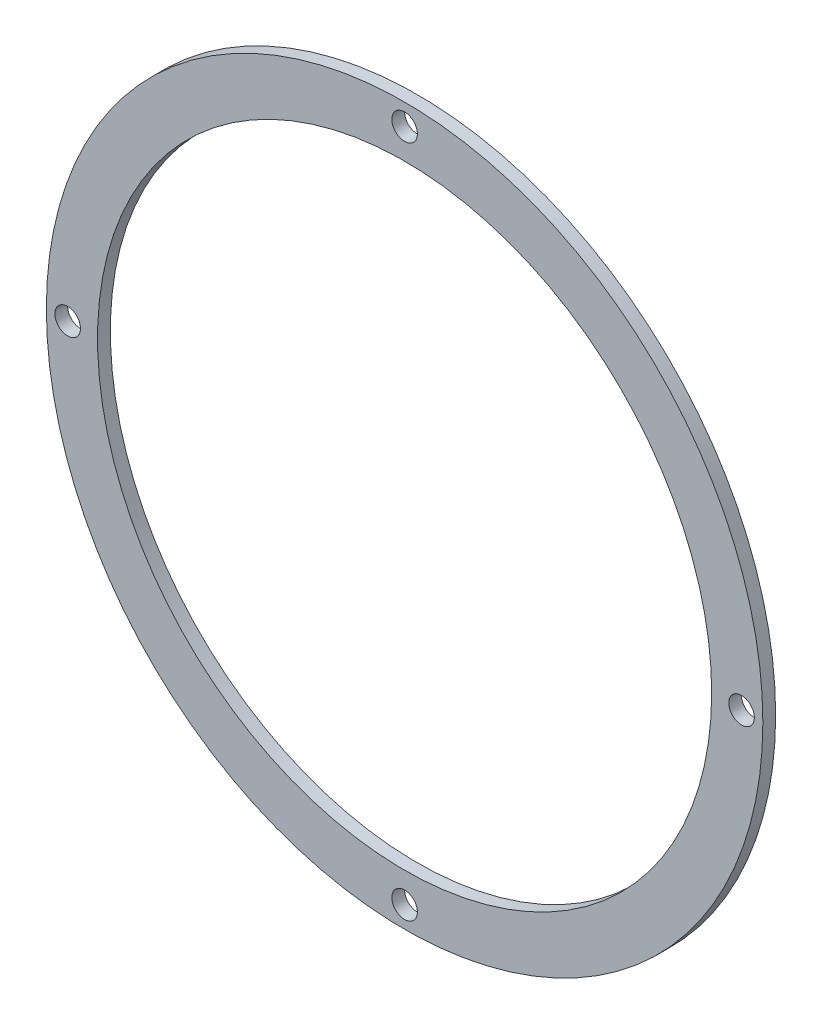
ISO-10303-21;
HEADER;
FILE_DESCRIPTION(('STEP AP214'),'2;1');
FILE_NAME('part.step','',(''),(''),'','','');
FILE_SCHEMA(('AUTOMOTIVE_DESIGN { 1 0 10303 214 1 1 1 1 }'));
ENDSEC;
DATA;
#1=APPLICATION_CONTEXT('core data for automotive mechanical design processes');
#2=APPLICATION_PROTOCOL_DEFINITION('international standard','automotive_design',2000,#1);
#3=PRODUCT_CONTEXT('',#1,'mechanical');
#4=PRODUCT('Part','Part','',(#3));
#5=PRODUCT_RELATED_PRODUCT_CATEGORY('part','',(#4));
#6=PRODUCT_DEFINITION_FORMATION('','',#4);
#7=PRODUCT_DEFINITION_CONTEXT('part definition',#1,'design');
#8=PRODUCT_DEFINITION('design','',#6,#7);
#9=PRODUCT_DEFINITION_SHAPE('','',#8);
#10=(LENGTH_UNIT() NAMED_UNIT(*) SI_UNIT(.MILLI.,.METRE.));
#11=(NAMED_UNIT(*) PLANE_ANGLE_UNIT() SI_UNIT($,.RADIAN.));
#12=(NAMED_UNIT(*) SI_UNIT($,.STERADIAN.) SOLID_ANGLE_UNIT());
#13=UNCERTAINTY_MEASURE_WITH_UNIT(LENGTH_MEASURE(1.E-05),#10,'distance_accuracy_value','');
#14=(GEOMETRIC_REPRESENTATION_CONTEXT(3) GLOBAL_UNCERTAINTY_ASSIGNED_CONTEXT((#13)) GLOBAL_UNIT_ASSIGNED_CONTEXT((#10,
#11,#12)) REPRESENTATION_CONTEXT('',''));
#15=CARTESIAN_POINT('',(0.,0.,0.));
#16=DIRECTION('',(0.,0.,1.));
#17=DIRECTION('',(1.,0.,0.));
#18=AXIS2_PLACEMENT_3D('',#15,#16,#17);
#19=CARTESIAN_POINT('',(0.,0.,3.));
#20=DIRECTION('',(0.,0.,1.));
#21=DIRECTION('',(1.,0.,0.));
#22=AXIS2_PLACEMENT_3D('',#19,#20,#21);
#23=PLANE('',#22);
#24=CARTESIAN_POINT('',(4.46160596086404E-12,-79.,3.));
#25=DIRECTION('',(0.,0.,1.));
#26=DIRECTION('',(1.,0.,0.));
#27=AXIS2_PLACEMENT_3D('',#24,#25,#26);
#28=CIRCLE('',#27,3.0000000000048);
#29=CARTESIAN_POINT('',(3.00000000000926,-79.,3.));
#30=VERTEX_POINT('',#29);
#31=EDGE_CURVE('E65',#30,#30,#28,.T.);
#32=ORIENTED_EDGE('',*,*,#31,.F.);
#33=EDGE_LOOP('',(#32));
#34=FACE_BOUND('',#33,.T.);
#35=CARTESIAN_POINT('',(0.,79.,3.));
#36=DIRECTION('',(0.,0.,1.));
#37=DIRECTION('',(1.,0.,0.));
#38=AXIS2_PLACEMENT_3D('',#35,#36,#37);
#39=CIRCLE('',#38,3.);
#40=CARTESIAN_POINT('',(3.,79.,3.));
#41=VERTEX_POINT('',#40);
#42=EDGE_CURVE('E53',#41,#41,#39,.T.);
#43=ORIENTED_EDGE('',*,*,#42,.F.);
#44=EDGE_LOOP('',(#43));
#45=FACE_BOUND('',#44,.T.);
#46=CARTESIAN_POINT('',(0.,0.,3.));
#47=DIRECTION('',(0.,0.,1.));
#48=DIRECTION('',(1.,0.,0.));
#49=AXIS2_PLACEMENT_3D('',#46,#47,#48);
#50=CIRCLE('',#49,84.);
#51=CARTESIAN_POINT('',(84.,0.,3.));
#52=VERTEX_POINT('',#51);
#53=EDGE_CURVE('E10',#52,#52,#50,.T.);
#54=ORIENTED_EDGE('',*,*,#53,.T.);
#55=EDGE_LOOP('',(#54));
#56=FACE_BOUND('',#55,.T.);
#57=CARTESIAN_POINT('',(0.,0.,3.));
#58=DIRECTION('',(0.,0.,1.));
#59=DIRECTION('',(1.,0.,0.));
#60=AXIS2_PLACEMENT_3D('',#57,#58,#59);
#61=CIRCLE('',#60,72.);
#62=CARTESIAN_POINT('',(72.,0.,3.));
#63=VERTEX_POINT('',#62);
#64=EDGE_CURVE('E48',#63,#63,#61,.T.);
#65=ORIENTED_EDGE('',*,*,#64,.F.);
#66=EDGE_LOOP('',(#65));
#67=FACE_BOUND('',#66,.T.);
#68=CARTESIAN_POINT('',(79.0000000000022,2.23080298043202E-12,3.));
#69=DIRECTION('',(0.,0.,1.));
#70=DIRECTION('',(1.,0.,0.));
#71=AXIS2_PLACEMENT_3D('',#68,#69,#70);
#72=CIRCLE('',#71,3.00000000000174);
#73=CARTESIAN_POINT('',(82.000000000004,2.23080298043202E-12,3.));
#74=VERTEX_POINT('',#73);
#75=EDGE_CURVE('E59',#74,#74,#72,.T.);
#76=ORIENTED_EDGE('',*,*,#75,.F.);
#77=EDGE_LOOP('',(#76));
#78=FACE_BOUND('',#77,.T.);
#79=CARTESIAN_POINT('',(-78.9999999999978,-2.24047769014528E-12,3.));
#80=DIRECTION('',(0.,0.,1.));
#81=DIRECTION('',(1.,0.,0.));
#82=AXIS2_PLACEMENT_3D('',#79,#80,#81);
#83=CIRCLE('',#82,3.00000000000359);
#84=CARTESIAN_POINT('',(-75.9999999999942,-2.24047769014528E-12,3.));
#85=VERTEX_POINT('',#84);
#86=EDGE_CURVE('E71',#85,#85,#83,.T.);
#87=ORIENTED_EDGE('',*,*,#86,.F.);
#88=EDGE_LOOP('',(#87));
#89=FACE_BOUND('',#88,.T.);
#90=ADVANCED_FACE('F37',(#34,#45,#56,#67,#78,#89),#23,.T.);
#91=CARTESIAN_POINT('',(0.,0.,0.));
#92=DIRECTION('',(0.,0.,1.));
#93=DIRECTION('',(1.,0.,0.));
#94=AXIS2_PLACEMENT_3D('',#91,#92,#93);
#95=PLANE('',#94);
#96=CARTESIAN_POINT('',(0.,0.,0.));
#97=DIRECTION('',(0.,0.,1.));
#98=DIRECTION('',(1.,0.,0.));
#99=AXIS2_PLACEMENT_3D('',#96,#97,#98);
#100=CIRCLE('',#99,84.);
#101=CARTESIAN_POINT('',(84.,0.,0.));
#102=VERTEX_POINT('',#101);
#103=EDGE_CURVE('E41',#102,#102,#100,.T.);
#104=ORIENTED_EDGE('',*,*,#103,.F.);
#105=EDGE_LOOP('',(#104));
#106=FACE_BOUND('',#105,.T.);
#107=CARTESIAN_POINT('',(0.,0.,0.));
#108=DIRECTION('',(0.,0.,1.));
#109=DIRECTION('',(1.,0.,0.));
#110=AXIS2_PLACEMENT_3D('',#107,#108,#109);
#111=CIRCLE('',#110,72.);
#112=CARTESIAN_POINT('',(72.,0.,0.));
#113=VERTEX_POINT('',#112);
#114=EDGE_CURVE('E50',#113,#113,#111,.T.);
#115=ORIENTED_EDGE('',*,*,#114,.T.);
#116=EDGE_LOOP('',(#115));
#117=FACE_BOUND('',#116,.T.);
#118=CARTESIAN_POINT('',(0.,79.,0.));
#119=DIRECTION('',(0.,0.,1.));
#120=DIRECTION('',(1.,0.,0.));
#121=AXIS2_PLACEMENT_3D('',#118,#119,#120);
#122=CIRCLE('',#121,3.);
#123=CARTESIAN_POINT('',(3.,79.,0.));
#124=VERTEX_POINT('',#123);
#125=EDGE_CURVE('E56',#124,#124,#122,.T.);
#126=ORIENTED_EDGE('',*,*,#125,.T.);
#127=EDGE_LOOP('',(#126));
#128=FACE_BOUND('',#127,.T.);
#129=CARTESIAN_POINT('',(79.0000000000022,2.23080298043202E-12,0.));
#130=DIRECTION('',(0.,0.,1.));
#131=DIRECTION('',(1.,0.,0.));
#132=AXIS2_PLACEMENT_3D('',#129,#130,#131);
#133=CIRCLE('',#132,3.00000000000174);
#134=CARTESIAN_POINT('',(82.000000000004,2.23080298043202E-12,0.));
#135=VERTEX_POINT('',#134);
#136=EDGE_CURVE('E62',#135,#135,#133,.T.);
#137=ORIENTED_EDGE('',*,*,#136,.T.);
#138=EDGE_LOOP('',(#137));
#139=FACE_BOUND('',#138,.T.);
#140=CARTESIAN_POINT('',(4.46160596086404E-12,-79.,0.));
#141=DIRECTION('',(0.,0.,1.));
#142=DIRECTION('',(1.,0.,0.));
#143=AXIS2_PLACEMENT_3D('',#140,#141,#142);
#144=CIRCLE('',#143,3.0000000000048);
#145=CARTESIAN_POINT('',(3.00000000000926,-79.,0.));
#146=VERTEX_POINT('',#145);
#147=EDGE_CURVE('E68',#146,#146,#144,.T.);
#148=ORIENTED_EDGE('',*,*,#147,.T.);
#149=EDGE_LOOP('',(#148));
#150=FACE_BOUND('',#149,.T.);
#151=CARTESIAN_POINT('',(-78.9999999999978,-2.24047769014528E-12,0.));
#152=DIRECTION('',(0.,0.,1.));
#153=DIRECTION('',(1.,0.,0.));
#154=AXIS2_PLACEMENT_3D('',#151,#152,#153);
#155=CIRCLE('',#154,3.00000000000359);
#156=CARTESIAN_POINT('',(-75.9999999999942,-2.24047769014528E-12,0.));
#157=VERTEX_POINT('',#156);
#158=EDGE_CURVE('E74',#157,#157,#155,.T.);
#159=ORIENTED_EDGE('',*,*,#158,.T.);
#160=EDGE_LOOP('',(#159));
#161=FACE_BOUND('',#160,.T.);
#162=ADVANCED_FACE('F84',(#106,#117,#128,#139,#150,#161),#95,.F.);
#163=CARTESIAN_POINT('',(0.,0.,3.));
#164=DIRECTION('',(0.,0.,-1.));
#165=DIRECTION('',(-1.,0.,0.));
#166=AXIS2_PLACEMENT_3D('',#163,#164,#165);
#167=CYLINDRICAL_SURFACE('',#166,84.);
#168=ORIENTED_EDGE('',*,*,#53,.F.);
#169=EDGE_LOOP('',(#168));
#170=FACE_BOUND('',#169,.T.);
#171=ORIENTED_EDGE('',*,*,#103,.T.);
#172=EDGE_LOOP('',(#171));
#173=FACE_BOUND('',#172,.T.);
#174=ADVANCED_FACE('F39',(#170,#173),#167,.T.);
#175=CARTESIAN_POINT('',(0.,0.,3.));
#176=DIRECTION('',(0.,0.,-1.));
#177=DIRECTION('',(-1.,0.,0.));
#178=AXIS2_PLACEMENT_3D('',#175,#176,#177);
#179=CYLINDRICAL_SURFACE('',#178,72.);
#180=ORIENTED_EDGE('',*,*,#64,.T.);
#181=EDGE_LOOP('',(#180));
#182=FACE_BOUND('',#181,.T.);
#183=ORIENTED_EDGE('',*,*,#114,.F.);
#184=EDGE_LOOP('',(#183));
#185=FACE_BOUND('',#184,.T.);
#186=ADVANCED_FACE('F94',(#182,#185),#179,.F.);
#187=CARTESIAN_POINT('',(0.,79.,3.));
#188=DIRECTION('',(0.,0.,-1.));
#189=DIRECTION('',(-1.,0.,0.));
#190=AXIS2_PLACEMENT_3D('',#187,#188,#189);
#191=CYLINDRICAL_SURFACE('',#190,3.);
#192=ORIENTED_EDGE('',*,*,#42,.T.);
#193=EDGE_LOOP('',(#192));
#194=FACE_BOUND('',#193,.T.);
#195=ORIENTED_EDGE('',*,*,#125,.F.);
#196=EDGE_LOOP('',(#195));
#197=FACE_BOUND('',#196,.T.);
#198=ADVANCED_FACE('F97',(#194,#197),#191,.F.);
#199=CARTESIAN_POINT('',(79.0000000000022,2.23080298043202E-12,3.));
#200=DIRECTION('',(0.,0.,-1.));
#201=DIRECTION('',(-1.,0.,0.));
#202=AXIS2_PLACEMENT_3D('',#199,#200,#201);
#203=CYLINDRICAL_SURFACE('',#202,3.00000000000174);
#204=ORIENTED_EDGE('',*,*,#75,.T.);
#205=EDGE_LOOP('',(#204));
#206=FACE_BOUND('',#205,.T.);
#207=ORIENTED_EDGE('',*,*,#136,.F.);
#208=EDGE_LOOP('',(#207));
#209=FACE_BOUND('',#208,.T.);
#210=ADVANCED_FACE('F101',(#206,#209),#203,.F.);
#211=CARTESIAN_POINT('',(4.46160596086404E-12,-79.,3.));
#212=DIRECTION('',(0.,0.,-1.));
#213=DIRECTION('',(-1.,0.,0.));
#214=AXIS2_PLACEMENT_3D('',#211,#212,#213);
#215=CYLINDRICAL_SURFACE('',#214,3.0000000000048);
#216=ORIENTED_EDGE('',*,*,#31,.T.);
#217=EDGE_LOOP('',(#216));
#218=FACE_BOUND('',#217,.T.);
#219=ORIENTED_EDGE('',*,*,#147,.F.);
#220=EDGE_LOOP('',(#219));
#221=FACE_BOUND('',#220,.T.);
#222=ADVANCED_FACE('F105',(#218,#221),#215,.F.);
#223=CARTESIAN_POINT('',(-78.9999999999978,-2.24047769014528E-12,3.));
#224=DIRECTION('',(0.,0.,-1.));
#225=DIRECTION('',(-1.,0.,0.));
#226=AXIS2_PLACEMENT_3D('',#223,#224,#225);
#227=CYLINDRICAL_SURFACE('',#226,3.00000000000359);
#228=ORIENTED_EDGE('',*,*,#86,.T.);
#229=EDGE_LOOP('',(#228));
#230=FACE_BOUND('',#229,.T.);
#231=ORIENTED_EDGE('',*,*,#158,.F.);
#232=EDGE_LOOP('',(#231));
#233=FACE_BOUND('',#232,.T.);
#234=ADVANCED_FACE('F80',(#230,#233),#227,.F.);
#235=CLOSED_SHELL('',(#90,#162,#174,#186,#198,#210,#222,#234));
#236=MANIFOLD_SOLID_BREP('B2',#235);
#237=ADVANCED_BREP_SHAPE_REPRESENTATION('',(#18,#236),#14);
#238=SHAPE_DEFINITION_REPRESENTATION(#9,#237);
ENDSEC;
END-ISO-10303-21;
